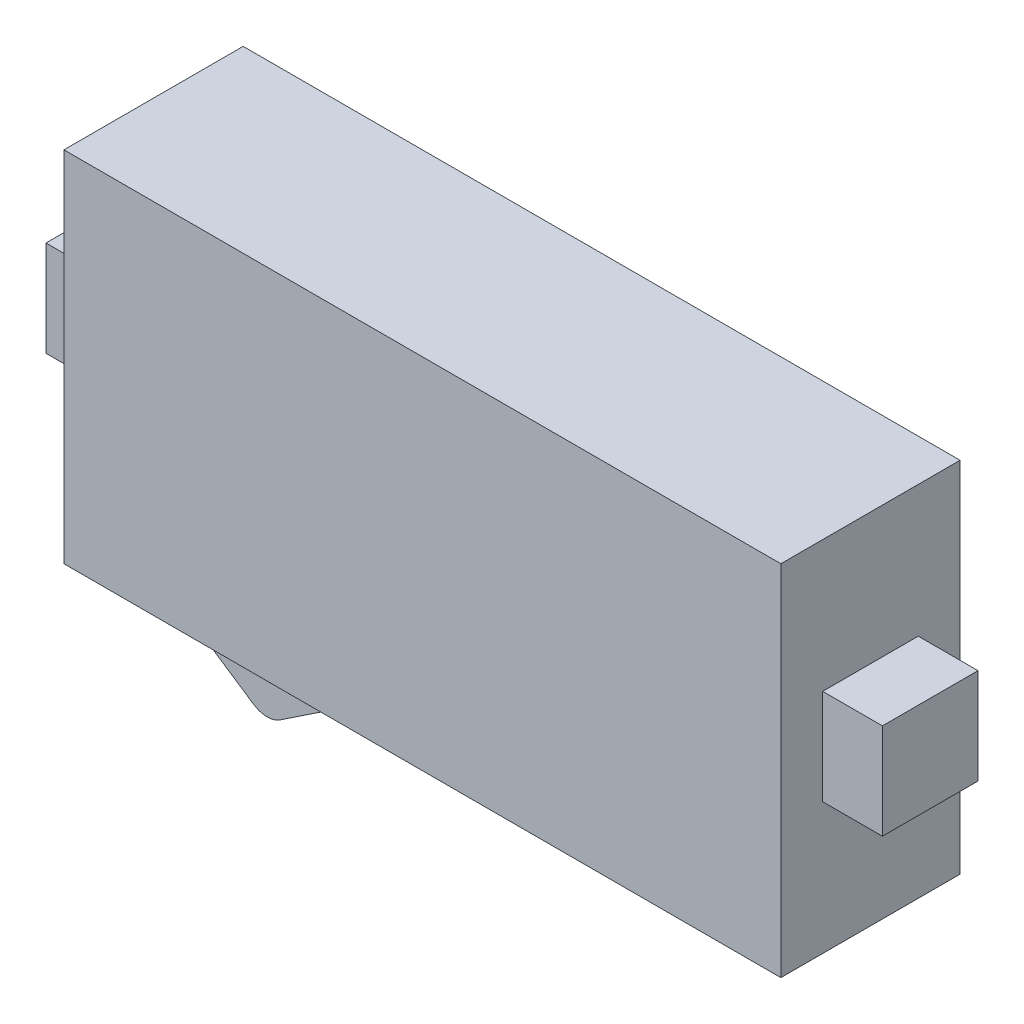
ISO-10303-21;
HEADER;
FILE_DESCRIPTION(('STEP AP214'),'2;1');
FILE_NAME('part.step','',(''),(''),'','','');
FILE_SCHEMA(('AUTOMOTIVE_DESIGN { 1 0 10303 214 1 1 1 1 }'));
ENDSEC;
DATA;
#1=APPLICATION_CONTEXT('core data for automotive mechanical design processes');
#2=APPLICATION_PROTOCOL_DEFINITION('international standard','automotive_design',2000,#1);
#3=PRODUCT_CONTEXT('',#1,'mechanical');
#4=PRODUCT('Part','Part','',(#3));
#5=PRODUCT_RELATED_PRODUCT_CATEGORY('part','',(#4));
#6=PRODUCT_DEFINITION_FORMATION('','',#4);
#7=PRODUCT_DEFINITION_CONTEXT('part definition',#1,'design');
#8=PRODUCT_DEFINITION('design','',#6,#7);
#9=PRODUCT_DEFINITION_SHAPE('','',#8);
#10=(LENGTH_UNIT() NAMED_UNIT(*) SI_UNIT(.MILLI.,.METRE.));
#11=(NAMED_UNIT(*) PLANE_ANGLE_UNIT() SI_UNIT($,.RADIAN.));
#12=(NAMED_UNIT(*) SI_UNIT($,.STERADIAN.) SOLID_ANGLE_UNIT());
#13=UNCERTAINTY_MEASURE_WITH_UNIT(LENGTH_MEASURE(1.E-05),#10,'distance_accuracy_value','');
#14=(GEOMETRIC_REPRESENTATION_CONTEXT(3) GLOBAL_UNCERTAINTY_ASSIGNED_CONTEXT((#13)) GLOBAL_UNIT_ASSIGNED_CONTEXT((#10,
#11,#12)) REPRESENTATION_CONTEXT('',''));
#15=CARTESIAN_POINT('',(0.,0.,0.));
#16=DIRECTION('',(0.,0.,1.));
#17=DIRECTION('',(1.,0.,0.));
#18=AXIS2_PLACEMENT_3D('',#15,#16,#17);
#19=CARTESIAN_POINT('',(-15.,-7.5,3.75));
#20=DIRECTION('',(1.,0.,0.));
#21=DIRECTION('',(0.,0.,-1.));
#22=AXIS2_PLACEMENT_3D('',#19,#20,#21);
#23=PLANE('',#22);
#24=DIRECTION('',(0.,-1.,0.));
#25=VECTOR('',#24,1.);
#26=CARTESIAN_POINT('',(-15.,-7.5,-3.75));
#27=LINE('',#26,#25);
#28=CARTESIAN_POINT('',(-15.,7.5,-3.75));
#29=VERTEX_POINT('',#28);
#30=CARTESIAN_POINT('',(-15.,-7.5,-3.75));
#31=VERTEX_POINT('',#30);
#32=EDGE_CURVE('E244',#29,#31,#27,.T.);
#33=ORIENTED_EDGE('',*,*,#32,.T.);
#34=DIRECTION('',(0.,0.,-1.));
#35=VECTOR('',#34,1.);
#36=CARTESIAN_POINT('',(-15.,-7.5,3.75));
#37=LINE('',#36,#35);
#38=CARTESIAN_POINT('',(-15.,-7.5,3.75));
#39=VERTEX_POINT('',#38);
#40=EDGE_CURVE('E271',#39,#31,#37,.T.);
#41=ORIENTED_EDGE('',*,*,#40,.F.);
#42=DIRECTION('',(0.,-1.,0.));
#43=VECTOR('',#42,1.);
#44=CARTESIAN_POINT('',(-15.,-7.5,3.75));
#45=LINE('',#44,#43);
#46=CARTESIAN_POINT('',(-15.,7.5,3.75));
#47=VERTEX_POINT('',#46);
#48=EDGE_CURVE('E245',#47,#39,#45,.T.);
#49=ORIENTED_EDGE('',*,*,#48,.F.);
#50=DIRECTION('',(0.,0.,-1.));
#51=VECTOR('',#50,1.);
#52=CARTESIAN_POINT('',(-15.,7.5,3.75));
#53=LINE('',#52,#51);
#54=EDGE_CURVE('E255',#47,#29,#53,.T.);
#55=ORIENTED_EDGE('',*,*,#54,.T.);
#56=EDGE_LOOP('',(#33,#41,#49,#55));
#57=FACE_BOUND('',#56,.T.);
#58=DIRECTION('',(0.,1.,0.));
#59=VECTOR('',#58,1.);
#60=CARTESIAN_POINT('',(-15.,2.,2.));
#61=LINE('',#60,#59);
#62=CARTESIAN_POINT('',(-15.,-2.,2.));
#63=VERTEX_POINT('',#62);
#64=CARTESIAN_POINT('',(-15.,2.,2.));
#65=VERTEX_POINT('',#64);
#66=EDGE_CURVE('E211',#63,#65,#61,.T.);
#67=ORIENTED_EDGE('',*,*,#66,.F.);
#68=DIRECTION('',(0.,0.,1.));
#69=VECTOR('',#68,1.);
#70=CARTESIAN_POINT('',(-15.,-2.,-2.));
#71=LINE('',#70,#69);
#72=CARTESIAN_POINT('',(-15.,-2.,-2.));
#73=VERTEX_POINT('',#72);
#74=EDGE_CURVE('E216',#73,#63,#71,.T.);
#75=ORIENTED_EDGE('',*,*,#74,.F.);
#76=DIRECTION('',(0.,-1.,0.));
#77=VECTOR('',#76,1.);
#78=CARTESIAN_POINT('',(-15.,2.,-2.));
#79=LINE('',#78,#77);
#80=CARTESIAN_POINT('',(-15.,2.,-2.));
#81=VERTEX_POINT('',#80);
#82=EDGE_CURVE('E228',#81,#73,#79,.T.);
#83=ORIENTED_EDGE('',*,*,#82,.F.);
#84=DIRECTION('',(0.,0.,-1.));
#85=VECTOR('',#84,1.);
#86=CARTESIAN_POINT('',(-15.,2.,-2.));
#87=LINE('',#86,#85);
#88=EDGE_CURVE('E225',#65,#81,#87,.T.);
#89=ORIENTED_EDGE('',*,*,#88,.F.);
#90=EDGE_LOOP('',(#67,#75,#83,#89));
#91=FACE_BOUND('',#90,.T.);
#92=ADVANCED_FACE('F37',(#57,#91),#23,.F.);
#93=CARTESIAN_POINT('',(15.,-7.5,3.75));
#94=DIRECTION('',(0.,1.,0.));
#95=DIRECTION('',(-1.,0.,0.));
#96=AXIS2_PLACEMENT_3D('',#93,#94,#95);
#97=PLANE('',#96);
#98=DIRECTION('',(0.,0.,1.));
#99=VECTOR('',#98,1.);
#100=CARTESIAN_POINT('',(-3.5,-7.5,-2.25));
#101=LINE('',#100,#99);
#102=CARTESIAN_POINT('',(-3.49999999999999,-7.5,-2.25));
#103=VERTEX_POINT('',#102);
#104=CARTESIAN_POINT('',(-3.5,-7.5,2.25));
#105=VERTEX_POINT('',#104);
#106=EDGE_CURVE('E161',#103,#105,#101,.T.);
#107=ORIENTED_EDGE('',*,*,#106,.F.);
#108=DIRECTION('',(-1.,0.,0.));
#109=VECTOR('',#108,1.);
#110=CARTESIAN_POINT('',(-12.5,-7.5,-2.25));
#111=LINE('',#110,#109);
#112=CARTESIAN_POINT('',(-12.5,-7.5,-2.25));
#113=VERTEX_POINT('',#112);
#114=EDGE_CURVE('E157',#103,#113,#111,.T.);
#115=ORIENTED_EDGE('',*,*,#114,.T.);
#116=DIRECTION('',(0.,0.,1.));
#117=VECTOR('',#116,1.);
#118=CARTESIAN_POINT('',(-12.5,-7.5,-2.25));
#119=LINE('',#118,#117);
#120=CARTESIAN_POINT('',(-12.5,-7.5,2.25));
#121=VERTEX_POINT('',#120);
#122=EDGE_CURVE('E148',#113,#121,#119,.T.);
#123=ORIENTED_EDGE('',*,*,#122,.T.);
#124=DIRECTION('',(-1.,0.,0.));
#125=VECTOR('',#124,1.);
#126=CARTESIAN_POINT('',(-12.5,-7.5,2.25));
#127=LINE('',#126,#125);
#128=EDGE_CURVE('E154',#105,#121,#127,.T.);
#129=ORIENTED_EDGE('',*,*,#128,.F.);
#130=EDGE_LOOP('',(#107,#115,#123,#129));
#131=FACE_BOUND('',#130,.T.);
#132=DIRECTION('',(1.,0.,0.));
#133=VECTOR('',#132,1.);
#134=CARTESIAN_POINT('',(15.,-7.5,-3.75));
#135=LINE('',#134,#133);
#136=CARTESIAN_POINT('',(15.,-7.5,-3.75));
#137=VERTEX_POINT('',#136);
#138=EDGE_CURVE('E258',#31,#137,#135,.T.);
#139=ORIENTED_EDGE('',*,*,#138,.T.);
#140=DIRECTION('',(0.,0.,-1.));
#141=VECTOR('',#140,1.);
#142=CARTESIAN_POINT('',(15.,-7.5,3.75));
#143=LINE('',#142,#141);
#144=CARTESIAN_POINT('',(15.,-7.5,3.75));
#145=VERTEX_POINT('',#144);
#146=EDGE_CURVE('E268',#145,#137,#143,.T.);
#147=ORIENTED_EDGE('',*,*,#146,.F.);
#148=DIRECTION('',(1.,0.,0.));
#149=VECTOR('',#148,1.);
#150=CARTESIAN_POINT('',(15.,-7.5,3.75));
#151=LINE('',#150,#149);
#152=EDGE_CURVE('E248',#39,#145,#151,.T.);
#153=ORIENTED_EDGE('',*,*,#152,.F.);
#154=ORIENTED_EDGE('',*,*,#40,.T.);
#155=EDGE_LOOP('',(#139,#147,#153,#154));
#156=FACE_BOUND('',#155,.T.);
#157=ADVANCED_FACE('F151',(#131,#156),#97,.F.);
#158=CARTESIAN_POINT('',(15.,-7.5,3.75));
#159=DIRECTION('',(-1.,0.,0.));
#160=DIRECTION('',(0.,0.,1.));
#161=AXIS2_PLACEMENT_3D('',#158,#159,#160);
#162=PLANE('',#161);
#163=DIRECTION('',(0.,0.,1.));
#164=VECTOR('',#163,1.);
#165=CARTESIAN_POINT('',(15.,-2.,-2.));
#166=LINE('',#165,#164);
#167=CARTESIAN_POINT('',(15.,-2.,-2.));
#168=VERTEX_POINT('',#167);
#169=CARTESIAN_POINT('',(15.,-2.,2.));
#170=VERTEX_POINT('',#169);
#171=EDGE_CURVE('E195',#168,#170,#166,.T.);
#172=ORIENTED_EDGE('',*,*,#171,.T.);
#173=DIRECTION('',(0.,1.,0.));
#174=VECTOR('',#173,1.);
#175=CARTESIAN_POINT('',(15.,2.,2.));
#176=LINE('',#175,#174);
#177=CARTESIAN_POINT('',(15.,2.,2.));
#178=VERTEX_POINT('',#177);
#179=EDGE_CURVE('E177',#170,#178,#176,.T.);
#180=ORIENTED_EDGE('',*,*,#179,.T.);
#181=DIRECTION('',(0.,0.,-1.));
#182=VECTOR('',#181,1.);
#183=CARTESIAN_POINT('',(15.,2.,-2.));
#184=LINE('',#183,#182);
#185=CARTESIAN_POINT('',(15.,2.,-2.));
#186=VERTEX_POINT('',#185);
#187=EDGE_CURVE('E183',#178,#186,#184,.T.);
#188=ORIENTED_EDGE('',*,*,#187,.T.);
#189=DIRECTION('',(0.,-1.,0.));
#190=VECTOR('',#189,1.);
#191=CARTESIAN_POINT('',(15.,2.,-2.));
#192=LINE('',#191,#190);
#193=EDGE_CURVE('E198',#186,#168,#192,.T.);
#194=ORIENTED_EDGE('',*,*,#193,.T.);
#195=EDGE_LOOP('',(#172,#180,#188,#194));
#196=FACE_BOUND('',#195,.T.);
#197=DIRECTION('',(0.,1.,0.));
#198=VECTOR('',#197,1.);
#199=CARTESIAN_POINT('',(15.,-7.5,-3.75));
#200=LINE('',#199,#198);
#201=CARTESIAN_POINT('',(15.,7.5,-3.75));
#202=VERTEX_POINT('',#201);
#203=EDGE_CURVE('E260',#137,#202,#200,.T.);
#204=ORIENTED_EDGE('',*,*,#203,.T.);
#205=DIRECTION('',(0.,0.,-1.));
#206=VECTOR('',#205,1.);
#207=CARTESIAN_POINT('',(15.,7.5,3.75));
#208=LINE('',#207,#206);
#209=CARTESIAN_POINT('',(15.,7.5,3.75));
#210=VERTEX_POINT('',#209);
#211=EDGE_CURVE('E265',#210,#202,#208,.T.);
#212=ORIENTED_EDGE('',*,*,#211,.F.);
#213=DIRECTION('',(0.,1.,0.));
#214=VECTOR('',#213,1.);
#215=CARTESIAN_POINT('',(15.,-7.5,3.75));
#216=LINE('',#215,#214);
#217=EDGE_CURVE('E251',#145,#210,#216,.T.);
#218=ORIENTED_EDGE('',*,*,#217,.F.);
#219=ORIENTED_EDGE('',*,*,#146,.T.);
#220=EDGE_LOOP('',(#204,#212,#218,#219));
#221=FACE_BOUND('',#220,.T.);
#222=ADVANCED_FACE('F288',(#196,#221),#162,.F.);
#223=CARTESIAN_POINT('',(15.,7.5,3.75));
#224=DIRECTION('',(0.,-1.,0.));
#225=DIRECTION('',(1.,0.,0.));
#226=AXIS2_PLACEMENT_3D('',#223,#224,#225);
#227=PLANE('',#226);
#228=DIRECTION('',(-1.,0.,0.));
#229=VECTOR('',#228,1.);
#230=CARTESIAN_POINT('',(15.,7.5,-3.75));
#231=LINE('',#230,#229);
#232=EDGE_CURVE('E249',#202,#29,#231,.T.);
#233=ORIENTED_EDGE('',*,*,#232,.T.);
#234=ORIENTED_EDGE('',*,*,#54,.F.);
#235=DIRECTION('',(-1.,0.,0.));
#236=VECTOR('',#235,1.);
#237=CARTESIAN_POINT('',(15.,7.5,3.75));
#238=LINE('',#237,#236);
#239=EDGE_CURVE('E253',#210,#47,#238,.T.);
#240=ORIENTED_EDGE('',*,*,#239,.F.);
#241=ORIENTED_EDGE('',*,*,#211,.T.);
#242=EDGE_LOOP('',(#233,#234,#240,#241));
#243=FACE_BOUND('',#242,.T.);
#244=ADVANCED_FACE('F292',(#243),#227,.F.);
#245=CARTESIAN_POINT('',(0.,0.,3.75));
#246=DIRECTION('',(0.,0.,1.));
#247=DIRECTION('',(1.,0.,0.));
#248=AXIS2_PLACEMENT_3D('',#245,#246,#247);
#249=PLANE('',#248);
#250=ORIENTED_EDGE('',*,*,#48,.T.);
#251=ORIENTED_EDGE('',*,*,#152,.T.);
#252=ORIENTED_EDGE('',*,*,#217,.T.);
#253=ORIENTED_EDGE('',*,*,#239,.T.);
#254=EDGE_LOOP('',(#250,#251,#252,#253));
#255=FACE_BOUND('',#254,.T.);
#256=ADVANCED_FACE('F294',(#255),#249,.T.);
#257=CARTESIAN_POINT('',(0.,0.,-3.75));
#258=DIRECTION('',(0.,0.,1.));
#259=DIRECTION('',(1.,0.,0.));
#260=AXIS2_PLACEMENT_3D('',#257,#258,#259);
#261=PLANE('',#260);
#262=ORIENTED_EDGE('',*,*,#32,.F.);
#263=ORIENTED_EDGE('',*,*,#232,.F.);
#264=ORIENTED_EDGE('',*,*,#203,.F.);
#265=ORIENTED_EDGE('',*,*,#138,.F.);
#266=EDGE_LOOP('',(#262,#263,#264,#265));
#267=FACE_BOUND('',#266,.T.);
#268=ADVANCED_FACE('F284',(#267),#261,.F.);
#269=CARTESIAN_POINT('',(-17.5,2.,2.));
#270=DIRECTION('',(0.,0.,-1.));
#271=DIRECTION('',(0.,1.,0.));
#272=AXIS2_PLACEMENT_3D('',#269,#270,#271);
#273=PLANE('',#272);
#274=ORIENTED_EDGE('',*,*,#66,.T.);
#275=DIRECTION('',(1.,0.,0.));
#276=VECTOR('',#275,1.);
#277=CARTESIAN_POINT('',(-17.5,2.,2.));
#278=LINE('',#277,#276);
#279=CARTESIAN_POINT('',(-17.5,2.,2.));
#280=VERTEX_POINT('',#279);
#281=EDGE_CURVE('E241',#280,#65,#278,.T.);
#282=ORIENTED_EDGE('',*,*,#281,.F.);
#283=DIRECTION('',(0.,1.,0.));
#284=VECTOR('',#283,1.);
#285=CARTESIAN_POINT('',(-17.5,2.,2.));
#286=LINE('',#285,#284);
#287=CARTESIAN_POINT('',(-17.5,-2.,2.));
#288=VERTEX_POINT('',#287);
#289=EDGE_CURVE('E212',#288,#280,#286,.T.);
#290=ORIENTED_EDGE('',*,*,#289,.F.);
#291=DIRECTION('',(1.,0.,0.));
#292=VECTOR('',#291,1.);
#293=CARTESIAN_POINT('',(-17.5,-2.,2.));
#294=LINE('',#293,#292);
#295=EDGE_CURVE('E222',#288,#63,#294,.T.);
#296=ORIENTED_EDGE('',*,*,#295,.T.);
#297=EDGE_LOOP('',(#274,#282,#290,#296));
#298=FACE_BOUND('',#297,.T.);
#299=ADVANCED_FACE('F301',(#298),#273,.F.);
#300=CARTESIAN_POINT('',(-17.5,2.,-2.));
#301=DIRECTION('',(0.,-1.,0.));
#302=DIRECTION('',(0.,0.,-1.));
#303=AXIS2_PLACEMENT_3D('',#300,#301,#302);
#304=PLANE('',#303);
#305=ORIENTED_EDGE('',*,*,#88,.T.);
#306=DIRECTION('',(1.,0.,0.));
#307=VECTOR('',#306,1.);
#308=CARTESIAN_POINT('',(-17.5,2.,-2.));
#309=LINE('',#308,#307);
#310=CARTESIAN_POINT('',(-17.5,2.,-2.));
#311=VERTEX_POINT('',#310);
#312=EDGE_CURVE('E238',#311,#81,#309,.T.);
#313=ORIENTED_EDGE('',*,*,#312,.F.);
#314=DIRECTION('',(0.,0.,-1.));
#315=VECTOR('',#314,1.);
#316=CARTESIAN_POINT('',(-17.5,2.,-2.));
#317=LINE('',#316,#315);
#318=EDGE_CURVE('E215',#280,#311,#317,.T.);
#319=ORIENTED_EDGE('',*,*,#318,.F.);
#320=ORIENTED_EDGE('',*,*,#281,.T.);
#321=EDGE_LOOP('',(#305,#313,#319,#320));
#322=FACE_BOUND('',#321,.T.);
#323=ADVANCED_FACE('F360',(#322),#304,.F.);
#324=CARTESIAN_POINT('',(-17.5,2.,-2.));
#325=DIRECTION('',(0.,0.,1.));
#326=DIRECTION('',(0.,-1.,0.));
#327=AXIS2_PLACEMENT_3D('',#324,#325,#326);
#328=PLANE('',#327);
#329=ORIENTED_EDGE('',*,*,#82,.T.);
#330=DIRECTION('',(1.,0.,0.));
#331=VECTOR('',#330,1.);
#332=CARTESIAN_POINT('',(-17.5,-2.,-2.));
#333=LINE('',#332,#331);
#334=CARTESIAN_POINT('',(-17.5,-2.,-2.));
#335=VERTEX_POINT('',#334);
#336=EDGE_CURVE('E235',#335,#73,#333,.T.);
#337=ORIENTED_EDGE('',*,*,#336,.F.);
#338=DIRECTION('',(0.,-1.,0.));
#339=VECTOR('',#338,1.);
#340=CARTESIAN_POINT('',(-17.5,2.,-2.));
#341=LINE('',#340,#339);
#342=EDGE_CURVE('E218',#311,#335,#341,.T.);
#343=ORIENTED_EDGE('',*,*,#342,.F.);
#344=ORIENTED_EDGE('',*,*,#312,.T.);
#345=EDGE_LOOP('',(#329,#337,#343,#344));
#346=FACE_BOUND('',#345,.T.);
#347=ADVANCED_FACE('F356',(#346),#328,.F.);
#348=CARTESIAN_POINT('',(-17.5,-2.,-2.));
#349=DIRECTION('',(0.,1.,0.));
#350=DIRECTION('',(0.,0.,1.));
#351=AXIS2_PLACEMENT_3D('',#348,#349,#350);
#352=PLANE('',#351);
#353=ORIENTED_EDGE('',*,*,#74,.T.);
#354=ORIENTED_EDGE('',*,*,#295,.F.);
#355=DIRECTION('',(0.,0.,1.));
#356=VECTOR('',#355,1.);
#357=CARTESIAN_POINT('',(-17.5,-2.,-2.));
#358=LINE('',#357,#356);
#359=EDGE_CURVE('E220',#335,#288,#358,.T.);
#360=ORIENTED_EDGE('',*,*,#359,.F.);
#361=ORIENTED_EDGE('',*,*,#336,.T.);
#362=EDGE_LOOP('',(#353,#354,#360,#361));
#363=FACE_BOUND('',#362,.T.);
#364=ADVANCED_FACE('F352',(#363),#352,.F.);
#365=CARTESIAN_POINT('',(-17.5,0.,0.));
#366=DIRECTION('',(-1.,0.,0.));
#367=DIRECTION('',(0.,0.,1.));
#368=AXIS2_PLACEMENT_3D('',#365,#366,#367);
#369=PLANE('',#368);
#370=ORIENTED_EDGE('',*,*,#289,.T.);
#371=ORIENTED_EDGE('',*,*,#318,.T.);
#372=ORIENTED_EDGE('',*,*,#342,.T.);
#373=ORIENTED_EDGE('',*,*,#359,.T.);
#374=EDGE_LOOP('',(#370,#371,#372,#373));
#375=FACE_BOUND('',#374,.T.);
#376=ADVANCED_FACE('F349',(#375),#369,.T.);
#377=CARTESIAN_POINT('',(17.5,2.,2.));
#378=DIRECTION('',(0.,0.,1.));
#379=DIRECTION('',(0.,-1.,0.));
#380=AXIS2_PLACEMENT_3D('',#377,#378,#379);
#381=PLANE('',#380);
#382=ORIENTED_EDGE('',*,*,#179,.F.);
#383=DIRECTION('',(-1.,0.,0.));
#384=VECTOR('',#383,1.);
#385=CARTESIAN_POINT('',(17.5,-2.,2.));
#386=LINE('',#385,#384);
#387=CARTESIAN_POINT('',(17.5,-2.,2.));
#388=VERTEX_POINT('',#387);
#389=EDGE_CURVE('E209',#388,#170,#386,.T.);
#390=ORIENTED_EDGE('',*,*,#389,.F.);
#391=DIRECTION('',(0.,1.,0.));
#392=VECTOR('',#391,1.);
#393=CARTESIAN_POINT('',(17.5,2.,2.));
#394=LINE('',#393,#392);
#395=CARTESIAN_POINT('',(17.5,2.,2.));
#396=VERTEX_POINT('',#395);
#397=EDGE_CURVE('E179',#388,#396,#394,.T.);
#398=ORIENTED_EDGE('',*,*,#397,.T.);
#399=DIRECTION('',(-1.,0.,0.));
#400=VECTOR('',#399,1.);
#401=CARTESIAN_POINT('',(17.5,2.,2.));
#402=LINE('',#401,#400);
#403=EDGE_CURVE('E192',#396,#178,#402,.T.);
#404=ORIENTED_EDGE('',*,*,#403,.T.);
#405=EDGE_LOOP('',(#382,#390,#398,#404));
#406=FACE_BOUND('',#405,.T.);
#407=ADVANCED_FACE('F322',(#406),#381,.T.);
#408=CARTESIAN_POINT('',(17.5,-2.,-2.));
#409=DIRECTION('',(0.,-1.,0.));
#410=DIRECTION('',(0.,0.,-1.));
#411=AXIS2_PLACEMENT_3D('',#408,#409,#410);
#412=PLANE('',#411);
#413=ORIENTED_EDGE('',*,*,#171,.F.);
#414=DIRECTION('',(-1.,0.,0.));
#415=VECTOR('',#414,1.);
#416=CARTESIAN_POINT('',(17.5,-2.,-2.));
#417=LINE('',#416,#415);
#418=CARTESIAN_POINT('',(17.5,-2.,-2.));
#419=VERTEX_POINT('',#418);
#420=EDGE_CURVE('E207',#419,#168,#417,.T.);
#421=ORIENTED_EDGE('',*,*,#420,.F.);
#422=DIRECTION('',(0.,0.,1.));
#423=VECTOR('',#422,1.);
#424=CARTESIAN_POINT('',(17.5,-2.,-2.));
#425=LINE('',#424,#423);
#426=EDGE_CURVE('E182',#419,#388,#425,.T.);
#427=ORIENTED_EDGE('',*,*,#426,.T.);
#428=ORIENTED_EDGE('',*,*,#389,.T.);
#429=EDGE_LOOP('',(#413,#421,#427,#428));
#430=FACE_BOUND('',#429,.T.);
#431=ADVANCED_FACE('F318',(#430),#412,.T.);
#432=CARTESIAN_POINT('',(17.5,2.,-2.));
#433=DIRECTION('',(0.,0.,-1.));
#434=DIRECTION('',(0.,1.,0.));
#435=AXIS2_PLACEMENT_3D('',#432,#433,#434);
#436=PLANE('',#435);
#437=ORIENTED_EDGE('',*,*,#193,.F.);
#438=DIRECTION('',(-1.,0.,0.));
#439=VECTOR('',#438,1.);
#440=CARTESIAN_POINT('',(17.5,2.,-2.));
#441=LINE('',#440,#439);
#442=CARTESIAN_POINT('',(17.5,2.,-2.));
#443=VERTEX_POINT('',#442);
#444=EDGE_CURVE('E204',#443,#186,#441,.T.);
#445=ORIENTED_EDGE('',*,*,#444,.F.);
#446=DIRECTION('',(0.,-1.,0.));
#447=VECTOR('',#446,1.);
#448=CARTESIAN_POINT('',(17.5,2.,-2.));
#449=LINE('',#448,#447);
#450=EDGE_CURVE('E186',#443,#419,#449,.T.);
#451=ORIENTED_EDGE('',*,*,#450,.T.);
#452=ORIENTED_EDGE('',*,*,#420,.T.);
#453=EDGE_LOOP('',(#437,#445,#451,#452));
#454=FACE_BOUND('',#453,.T.);
#455=ADVANCED_FACE('F329',(#454),#436,.T.);
#456=CARTESIAN_POINT('',(17.5,2.,-2.));
#457=DIRECTION('',(0.,1.,0.));
#458=DIRECTION('',(0.,0.,1.));
#459=AXIS2_PLACEMENT_3D('',#456,#457,#458);
#460=PLANE('',#459);
#461=ORIENTED_EDGE('',*,*,#187,.F.);
#462=ORIENTED_EDGE('',*,*,#403,.F.);
#463=DIRECTION('',(0.,0.,-1.));
#464=VECTOR('',#463,1.);
#465=CARTESIAN_POINT('',(17.5,2.,-2.));
#466=LINE('',#465,#464);
#467=EDGE_CURVE('E189',#396,#443,#466,.T.);
#468=ORIENTED_EDGE('',*,*,#467,.T.);
#469=ORIENTED_EDGE('',*,*,#444,.T.);
#470=EDGE_LOOP('',(#461,#462,#468,#469));
#471=FACE_BOUND('',#470,.T.);
#472=ADVANCED_FACE('F326',(#471),#460,.T.);
#473=CARTESIAN_POINT('',(17.5,0.,0.));
#474=DIRECTION('',(1.,0.,0.));
#475=DIRECTION('',(0.,0.,1.));
#476=AXIS2_PLACEMENT_3D('',#473,#474,#475);
#477=PLANE('',#476);
#478=ORIENTED_EDGE('',*,*,#397,.F.);
#479=ORIENTED_EDGE('',*,*,#426,.F.);
#480=ORIENTED_EDGE('',*,*,#450,.F.);
#481=ORIENTED_EDGE('',*,*,#467,.F.);
#482=EDGE_LOOP('',(#478,#479,#480,#481));
#483=FACE_BOUND('',#482,.T.);
#484=ADVANCED_FACE('F331',(#483),#477,.T.);
#485=CARTESIAN_POINT('',(-3.5,-7.5,-2.25));
#486=DIRECTION('',(0.554700196225229,-0.832050294337843,0.));
#487=DIRECTION('',(0.832050294337843,0.554700196225229,0.));
#488=AXIS2_PLACEMENT_3D('',#485,#486,#487);
#489=PLANE('',#488);
#490=DIRECTION('',(0.832050294337843,0.554700196225229,0.));
#491=VECTOR('',#490,1.);
#492=CARTESIAN_POINT('',(-3.5,-7.5,2.25));
#493=LINE('',#492,#491);
#494=CARTESIAN_POINT('',(-7.44529980377477,-10.1301998691832,2.25));
#495=VERTEX_POINT('',#494);
#496=EDGE_CURVE('E169',#495,#105,#493,.T.);
#497=ORIENTED_EDGE('',*,*,#496,.F.);
#498=DIRECTION('',(0.,0.,1.));
#499=VECTOR('',#498,1.);
#500=CARTESIAN_POINT('',(-7.44529980377477,-10.1301998691832,-2.25));
#501=LINE('',#500,#499);
#502=CARTESIAN_POINT('',(-7.44529980377477,-10.1301998691832,-2.25));
#503=VERTEX_POINT('',#502);
#504=EDGE_CURVE('E45',#495,#503,#501,.F.);
#505=ORIENTED_EDGE('',*,*,#504,.T.);
#506=DIRECTION('',(0.832050294337843,0.554700196225229,0.));
#507=VECTOR('',#506,1.);
#508=CARTESIAN_POINT('',(-3.5,-7.5,-2.25));
#509=LINE('',#508,#507);
#510=EDGE_CURVE('E162',#503,#103,#509,.T.);
#511=ORIENTED_EDGE('',*,*,#510,.T.);
#512=ORIENTED_EDGE('',*,*,#106,.T.);
#513=EDGE_LOOP('',(#497,#505,#511,#512));
#514=FACE_BOUND('',#513,.T.);
#515=ADVANCED_FACE('F333',(#514),#489,.T.);
#516=CARTESIAN_POINT('',(-12.5,-7.5,-2.25));
#517=DIRECTION('',(-0.554700196225229,-0.832050294337844,0.));
#518=DIRECTION('',(0.832050294337844,-0.554700196225229,0.));
#519=AXIS2_PLACEMENT_3D('',#516,#517,#518);
#520=PLANE('',#519);
#521=DIRECTION('',(0.832050294337844,-0.554700196225229,0.));
#522=VECTOR('',#521,1.);
#523=CARTESIAN_POINT('',(-12.5,-7.5,-2.25));
#524=LINE('',#523,#522);
#525=CARTESIAN_POINT('',(-8.55470019622522,-10.1301998691832,-2.25));
#526=VERTEX_POINT('',#525);
#527=EDGE_CURVE('E464',#113,#526,#524,.T.);
#528=ORIENTED_EDGE('',*,*,#527,.T.);
#529=DIRECTION('',(0.,0.,1.));
#530=VECTOR('',#529,1.);
#531=CARTESIAN_POINT('',(-8.55470019622522,-10.1301998691832,-2.25));
#532=LINE('',#531,#530);
#533=CARTESIAN_POINT('',(-8.55470019622522,-10.1301998691832,2.25));
#534=VERTEX_POINT('',#533);
#535=EDGE_CURVE('E168',#526,#534,#532,.T.);
#536=ORIENTED_EDGE('',*,*,#535,.T.);
#537=DIRECTION('',(0.832050294337844,-0.554700196225229,0.));
#538=VECTOR('',#537,1.);
#539=CARTESIAN_POINT('',(-12.5,-7.5,2.25));
#540=LINE('',#539,#538);
#541=EDGE_CURVE('E165',#121,#534,#540,.T.);
#542=ORIENTED_EDGE('',*,*,#541,.F.);
#543=ORIENTED_EDGE('',*,*,#122,.F.);
#544=EDGE_LOOP('',(#528,#536,#542,#543));
#545=FACE_BOUND('',#544,.T.);
#546=ADVANCED_FACE('F166',(#545),#520,.T.);
#547=CARTESIAN_POINT('',(0.,0.,-2.25));
#548=DIRECTION('',(0.,0.,-1.));
#549=DIRECTION('',(-1.,0.,0.));
#550=AXIS2_PLACEMENT_3D('',#547,#548,#549);
#551=PLANE('',#550);
#552=ORIENTED_EDGE('',*,*,#510,.F.);
#553=CARTESIAN_POINT('',(-8.,-9.29814957484534,-2.25));
#554=DIRECTION('',(0.,0.,-1.));
#555=DIRECTION('',(-1.,0.,0.));
#556=AXIS2_PLACEMENT_3D('',#553,#554,#555);
#557=CIRCLE('',#556,1.);
#558=EDGE_CURVE('E11',#503,#526,#557,.T.);
#559=ORIENTED_EDGE('',*,*,#558,.T.);
#560=ORIENTED_EDGE('',*,*,#527,.F.);
#561=ORIENTED_EDGE('',*,*,#114,.F.);
#562=EDGE_LOOP('',(#552,#559,#560,#561));
#563=FACE_BOUND('',#562,.T.);
#564=ADVANCED_FACE('F435',(#563),#551,.T.);
#565=CARTESIAN_POINT('',(0.,0.,2.25));
#566=DIRECTION('',(0.,0.,-1.));
#567=DIRECTION('',(-1.,0.,0.));
#568=AXIS2_PLACEMENT_3D('',#565,#566,#567);
#569=PLANE('',#568);
#570=ORIENTED_EDGE('',*,*,#541,.T.);
#571=CARTESIAN_POINT('',(-8.,-9.29814957484534,2.25));
#572=DIRECTION('',(0.,0.,-1.));
#573=DIRECTION('',(-1.,0.,0.));
#574=AXIS2_PLACEMENT_3D('',#571,#572,#573);
#575=CIRCLE('',#574,1.);
#576=EDGE_CURVE('E59',#534,#495,#575,.F.);
#577=ORIENTED_EDGE('',*,*,#576,.T.);
#578=ORIENTED_EDGE('',*,*,#496,.T.);
#579=ORIENTED_EDGE('',*,*,#128,.T.);
#580=EDGE_LOOP('',(#570,#577,#578,#579));
#581=FACE_BOUND('',#580,.T.);
#582=ADVANCED_FACE('F171',(#581),#569,.F.);
#583=CARTESIAN_POINT('',(-8.,-9.29814957484534,-2.25));
#584=DIRECTION('',(0.,0.,1.));
#585=DIRECTION('',(1.,0.,0.));
#586=AXIS2_PLACEMENT_3D('',#583,#584,#585);
#587=CYLINDRICAL_SURFACE('',#586,1.);
#588=ORIENTED_EDGE('',*,*,#558,.F.);
#589=ORIENTED_EDGE('',*,*,#504,.F.);
#590=ORIENTED_EDGE('',*,*,#576,.F.);
#591=ORIENTED_EDGE('',*,*,#535,.F.);
#592=EDGE_LOOP('',(#588,#589,#590,#591));
#593=FACE_BOUND('',#592,.T.);
#594=ADVANCED_FACE('F39',(#593),#587,.T.);
#595=CLOSED_SHELL('',(#92,#157,#222,#244,#256,#268,#299,#323,#347,#364,#376,#407,#431,#455,#472,
#484,#515,#546,#564,#582,#594));
#596=MANIFOLD_SOLID_BREP('B2',#595);
#597=ADVANCED_BREP_SHAPE_REPRESENTATION('',(#18,#596),#14);
#598=SHAPE_DEFINITION_REPRESENTATION(#9,#597);
ENDSEC;
END-ISO-10303-21;
